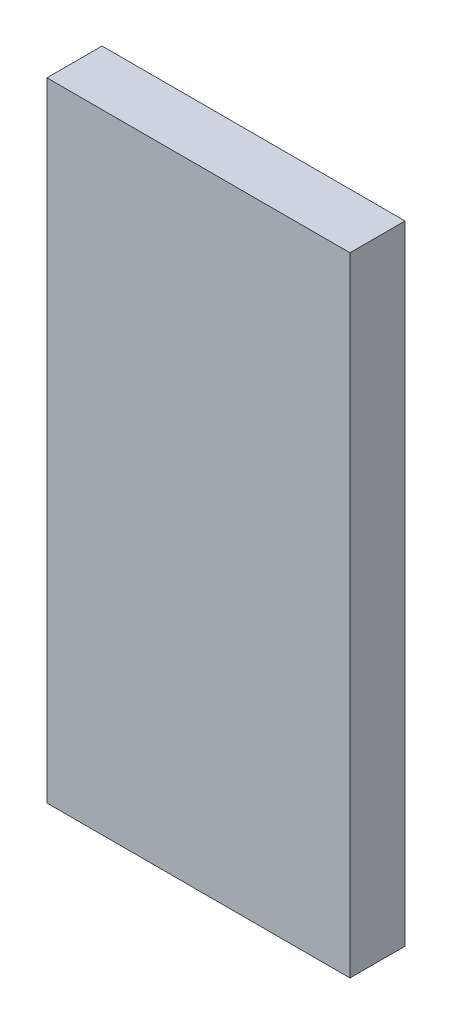
ISO-10303-21;
HEADER;
FILE_DESCRIPTION(('STEP AP214'),'2;1');
FILE_NAME('part.step','',(''),(''),'','','');
FILE_SCHEMA(('AUTOMOTIVE_DESIGN { 1 0 10303 214 1 1 1 1 }'));
ENDSEC;
DATA;
#1=APPLICATION_CONTEXT('core data for automotive mechanical design processes');
#2=APPLICATION_PROTOCOL_DEFINITION('international standard','automotive_design',2000,#1);
#3=PRODUCT_CONTEXT('',#1,'mechanical');
#4=PRODUCT('Part','Part','',(#3));
#5=PRODUCT_RELATED_PRODUCT_CATEGORY('part','',(#4));
#6=PRODUCT_DEFINITION_FORMATION('','',#4);
#7=PRODUCT_DEFINITION_CONTEXT('part definition',#1,'design');
#8=PRODUCT_DEFINITION('design','',#6,#7);
#9=PRODUCT_DEFINITION_SHAPE('','',#8);
#10=(LENGTH_UNIT() NAMED_UNIT(*) SI_UNIT(.MILLI.,.METRE.));
#11=(NAMED_UNIT(*) PLANE_ANGLE_UNIT() SI_UNIT($,.RADIAN.));
#12=(NAMED_UNIT(*) SI_UNIT($,.STERADIAN.) SOLID_ANGLE_UNIT());
#13=UNCERTAINTY_MEASURE_WITH_UNIT(LENGTH_MEASURE(1.E-05),#10,'distance_accuracy_value','');
#14=(GEOMETRIC_REPRESENTATION_CONTEXT(3) GLOBAL_UNCERTAINTY_ASSIGNED_CONTEXT((#13)) GLOBAL_UNIT_ASSIGNED_CONTEXT((#10,
#11,#12)) REPRESENTATION_CONTEXT('',''));
#15=CARTESIAN_POINT('',(0.,0.,0.));
#16=DIRECTION('',(0.,0.,1.));
#17=DIRECTION('',(1.,0.,0.));
#18=AXIS2_PLACEMENT_3D('',#15,#16,#17);
#19=CARTESIAN_POINT('',(-19.5,2.,-77.5));
#20=DIRECTION('',(0.,0.,1.));
#21=DIRECTION('',(1.,0.,0.));
#22=AXIS2_PLACEMENT_3D('',#19,#20,#21);
#23=PLANE('',#22);
#24=DIRECTION('',(-1.,0.,0.));
#25=VECTOR('',#24,1.);
#26=CARTESIAN_POINT('',(0.,31.8,-77.5));
#27=LINE('',#26,#25);
#28=CARTESIAN_POINT('',(5.5,31.8,-77.5));
#29=VERTEX_POINT('',#28);
#30=CARTESIAN_POINT('',(-5.5,31.8,-77.5));
#31=VERTEX_POINT('',#30);
#32=EDGE_CURVE('E51',#29,#31,#27,.T.);
#33=ORIENTED_EDGE('',*,*,#32,.F.);
#34=DIRECTION('',(0.,1.,0.));
#35=VECTOR('',#34,1.);
#36=CARTESIAN_POINT('',(5.5,0.,-77.5));
#37=LINE('',#36,#35);
#38=CARTESIAN_POINT('',(5.5,9.,-77.5));
#39=VERTEX_POINT('',#38);
#40=EDGE_CURVE('E80',#39,#29,#37,.T.);
#41=ORIENTED_EDGE('',*,*,#40,.F.);
#42=DIRECTION('',(-1.,0.,0.));
#43=VECTOR('',#42,1.);
#44=CARTESIAN_POINT('',(-14.5,9.,-77.5));
#45=LINE('',#44,#43);
#46=CARTESIAN_POINT('',(-5.5,9.,-77.5));
#47=VERTEX_POINT('',#46);
#48=EDGE_CURVE('E102',#39,#47,#45,.T.);
#49=ORIENTED_EDGE('',*,*,#48,.T.);
#50=DIRECTION('',(0.,1.,0.));
#51=VECTOR('',#50,1.);
#52=CARTESIAN_POINT('',(-5.5,0.,-77.5));
#53=LINE('',#52,#51);
#54=EDGE_CURVE('E58',#47,#31,#53,.T.);
#55=ORIENTED_EDGE('',*,*,#54,.T.);
#56=EDGE_LOOP('',(#33,#41,#49,#55));
#57=FACE_BOUND('',#56,.T.);
#58=ADVANCED_FACE('F37',(#57),#23,.F.);
#59=CARTESIAN_POINT('',(5.5,0.,-77.5));
#60=DIRECTION('',(1.,0.,0.));
#61=DIRECTION('',(0.,0.,-1.));
#62=AXIS2_PLACEMENT_3D('',#59,#60,#61);
#63=PLANE('',#62);
#64=ORIENTED_EDGE('',*,*,#40,.T.);
#65=DIRECTION('',(0.,0.,1.));
#66=VECTOR('',#65,1.);
#67=CARTESIAN_POINT('',(5.5,31.8,-77.5));
#68=LINE('',#67,#66);
#69=CARTESIAN_POINT('',(5.5,31.8,-75.5));
#70=VERTEX_POINT('',#69);
#71=EDGE_CURVE('E75',#29,#70,#68,.T.);
#72=ORIENTED_EDGE('',*,*,#71,.T.);
#73=DIRECTION('',(0.,-1.,0.));
#74=VECTOR('',#73,1.);
#75=CARTESIAN_POINT('',(5.5,40.,-75.5));
#76=LINE('',#75,#74);
#77=CARTESIAN_POINT('',(5.5,9.,-75.5));
#78=VERTEX_POINT('',#77);
#79=EDGE_CURVE('E97',#70,#78,#76,.T.);
#80=ORIENTED_EDGE('',*,*,#79,.T.);
#81=DIRECTION('',(0.,0.,1.));
#82=VECTOR('',#81,1.);
#83=CARTESIAN_POINT('',(5.5,9.,-77.5));
#84=LINE('',#83,#82);
#85=EDGE_CURVE('E90',#39,#78,#84,.T.);
#86=ORIENTED_EDGE('',*,*,#85,.F.);
#87=EDGE_LOOP('',(#64,#72,#80,#86));
#88=FACE_BOUND('',#87,.T.);
#89=ADVANCED_FACE('F88',(#88),#63,.T.);
#90=CARTESIAN_POINT('',(-5.5,0.,-77.5));
#91=DIRECTION('',(1.,0.,0.));
#92=DIRECTION('',(0.,0.,-1.));
#93=AXIS2_PLACEMENT_3D('',#90,#91,#92);
#94=PLANE('',#93);
#95=DIRECTION('',(0.,0.,1.));
#96=VECTOR('',#95,1.);
#97=CARTESIAN_POINT('',(-5.5,31.8,-77.5));
#98=LINE('',#97,#96);
#99=CARTESIAN_POINT('',(-5.5,31.8,-75.5));
#100=VERTEX_POINT('',#99);
#101=EDGE_CURVE('E81',#31,#100,#98,.T.);
#102=ORIENTED_EDGE('',*,*,#101,.F.);
#103=ORIENTED_EDGE('',*,*,#54,.F.);
#104=DIRECTION('',(0.,0.,1.));
#105=VECTOR('',#104,1.);
#106=CARTESIAN_POINT('',(-5.5,9.,-77.5));
#107=LINE('',#106,#105);
#108=CARTESIAN_POINT('',(-5.5,9.,-75.5));
#109=VERTEX_POINT('',#108);
#110=EDGE_CURVE('E94',#47,#109,#107,.T.);
#111=ORIENTED_EDGE('',*,*,#110,.T.);
#112=DIRECTION('',(0.,-1.,0.));
#113=VECTOR('',#112,1.);
#114=CARTESIAN_POINT('',(-5.5,40.,-75.5));
#115=LINE('',#114,#113);
#116=EDGE_CURVE('E99',#100,#109,#115,.T.);
#117=ORIENTED_EDGE('',*,*,#116,.F.);
#118=EDGE_LOOP('',(#102,#103,#111,#117));
#119=FACE_BOUND('',#118,.T.);
#120=ADVANCED_FACE('F110',(#119),#94,.F.);
#121=CARTESIAN_POINT('',(0.,40.,-75.5));
#122=DIRECTION('',(0.,0.,-1.));
#123=DIRECTION('',(-1.,0.,0.));
#124=AXIS2_PLACEMENT_3D('',#121,#122,#123);
#125=PLANE('',#124);
#126=DIRECTION('',(-1.,0.,0.));
#127=VECTOR('',#126,1.);
#128=CARTESIAN_POINT('',(21.9721359549996,31.8,-75.5));
#129=LINE('',#128,#127);
#130=EDGE_CURVE('E11',#70,#100,#129,.T.);
#131=ORIENTED_EDGE('',*,*,#130,.T.);
#132=ORIENTED_EDGE('',*,*,#116,.T.);
#133=DIRECTION('',(-1.,0.,0.));
#134=VECTOR('',#133,1.);
#135=CARTESIAN_POINT('',(-18.25,9.,-75.5));
#136=LINE('',#135,#134);
#137=EDGE_CURVE('E44',#78,#109,#136,.T.);
#138=ORIENTED_EDGE('',*,*,#137,.F.);
#139=ORIENTED_EDGE('',*,*,#79,.F.);
#140=EDGE_LOOP('',(#131,#132,#138,#139));
#141=FACE_BOUND('',#140,.T.);
#142=ADVANCED_FACE('F108',(#141),#125,.F.);
#143=CARTESIAN_POINT('',(-14.5,9.,-77.5));
#144=DIRECTION('',(0.,1.,0.));
#145=DIRECTION('',(-1.,0.,0.));
#146=AXIS2_PLACEMENT_3D('',#143,#144,#145);
#147=PLANE('',#146);
#148=ORIENTED_EDGE('',*,*,#137,.T.);
#149=ORIENTED_EDGE('',*,*,#110,.F.);
#150=ORIENTED_EDGE('',*,*,#48,.F.);
#151=ORIENTED_EDGE('',*,*,#85,.T.);
#152=EDGE_LOOP('',(#148,#149,#150,#151));
#153=FACE_BOUND('',#152,.T.);
#154=ADVANCED_FACE('F106',(#153),#147,.F.);
#155=CARTESIAN_POINT('',(0.,31.8,-77.5));
#156=DIRECTION('',(0.,1.,0.));
#157=DIRECTION('',(0.,0.,1.));
#158=AXIS2_PLACEMENT_3D('',#155,#156,#157);
#159=PLANE('',#158);
#160=ORIENTED_EDGE('',*,*,#130,.F.);
#161=ORIENTED_EDGE('',*,*,#71,.F.);
#162=ORIENTED_EDGE('',*,*,#32,.T.);
#163=ORIENTED_EDGE('',*,*,#101,.T.);
#164=EDGE_LOOP('',(#160,#161,#162,#163));
#165=FACE_BOUND('',#164,.T.);
#166=ADVANCED_FACE('F76',(#165),#159,.T.);
#167=CLOSED_SHELL('',(#58,#89,#120,#142,#154,#166));
#168=MANIFOLD_SOLID_BREP('B2',#167);
#169=ADVANCED_BREP_SHAPE_REPRESENTATION('',(#18,#168),#14);
#170=SHAPE_DEFINITION_REPRESENTATION(#9,#169);
ENDSEC;
END-ISO-10303-21;
